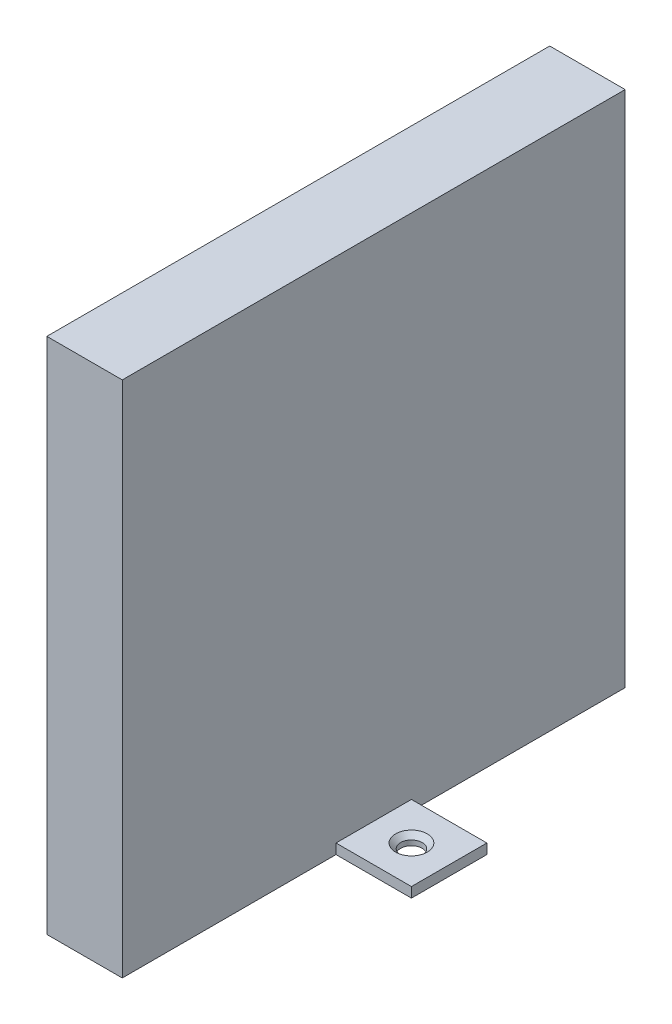
ISO-10303-21;
HEADER;
FILE_DESCRIPTION(('STEP AP214'),'2;1');
FILE_NAME('part.step','',(''),(''),'','','');
FILE_SCHEMA(('AUTOMOTIVE_DESIGN { 1 0 10303 214 1 1 1 1 }'));
ENDSEC;
DATA;
#1=APPLICATION_CONTEXT('core data for automotive mechanical design processes');
#2=APPLICATION_PROTOCOL_DEFINITION('international standard','automotive_design',2000,#1);
#3=PRODUCT_CONTEXT('',#1,'mechanical');
#4=PRODUCT('Part','Part','',(#3));
#5=PRODUCT_RELATED_PRODUCT_CATEGORY('part','',(#4));
#6=PRODUCT_DEFINITION_FORMATION('','',#4);
#7=PRODUCT_DEFINITION_CONTEXT('part definition',#1,'design');
#8=PRODUCT_DEFINITION('design','',#6,#7);
#9=PRODUCT_DEFINITION_SHAPE('','',#8);
#10=(LENGTH_UNIT() NAMED_UNIT(*) SI_UNIT(.MILLI.,.METRE.));
#11=(NAMED_UNIT(*) PLANE_ANGLE_UNIT() SI_UNIT($,.RADIAN.));
#12=(NAMED_UNIT(*) SI_UNIT($,.STERADIAN.) SOLID_ANGLE_UNIT());
#13=UNCERTAINTY_MEASURE_WITH_UNIT(LENGTH_MEASURE(1.E-05),#10,'distance_accuracy_value','');
#14=(GEOMETRIC_REPRESENTATION_CONTEXT(3) GLOBAL_UNCERTAINTY_ASSIGNED_CONTEXT((#13)) GLOBAL_UNIT_ASSIGNED_CONTEXT((#10,
#11,#12)) REPRESENTATION_CONTEXT('',''));
#15=CARTESIAN_POINT('',(0.,0.,0.));
#16=DIRECTION('',(0.,0.,1.));
#17=DIRECTION('',(1.,0.,0.));
#18=AXIS2_PLACEMENT_3D('',#15,#16,#17);
#19=CARTESIAN_POINT('',(15.,103.,0.));
#20=DIRECTION('',(-1.,0.,0.));
#21=DIRECTION('',(0.,0.,1.));
#22=AXIS2_PLACEMENT_3D('',#19,#20,#21);
#23=PLANE('',#22);
#24=DIRECTION('',(0.,-1.,0.));
#25=VECTOR('',#24,1.);
#26=CARTESIAN_POINT('',(15.,0.,-42.5));
#27=LINE('',#26,#25);
#28=CARTESIAN_POINT('',(15.,2.,-42.5));
#29=VERTEX_POINT('',#28);
#30=CARTESIAN_POINT('',(15.,0.,-42.5));
#31=VERTEX_POINT('',#30);
#32=EDGE_CURVE('E64',#29,#31,#27,.T.);
#33=ORIENTED_EDGE('',*,*,#32,.F.);
#34=DIRECTION('',(0.,0.,1.));
#35=VECTOR('',#34,1.);
#36=CARTESIAN_POINT('',(15.,2.,-42.5));
#37=LINE('',#36,#35);
#38=CARTESIAN_POINT('',(15.,2.,-57.5));
#39=VERTEX_POINT('',#38);
#40=EDGE_CURVE('E320',#39,#29,#37,.T.);
#41=ORIENTED_EDGE('',*,*,#40,.F.);
#42=DIRECTION('',(0.,1.,0.));
#43=VECTOR('',#42,1.);
#44=CARTESIAN_POINT('',(15.,2.,-57.5));
#45=LINE('',#44,#43);
#46=CARTESIAN_POINT('',(15.,0.,-57.5));
#47=VERTEX_POINT('',#46);
#48=EDGE_CURVE('E70',#47,#39,#45,.T.);
#49=ORIENTED_EDGE('',*,*,#48,.F.);
#50=DIRECTION('',(0.,0.,-1.));
#51=VECTOR('',#50,1.);
#52=CARTESIAN_POINT('',(15.,0.,0.));
#53=LINE('',#52,#51);
#54=CARTESIAN_POINT('',(15.,0.,-100.));
#55=VERTEX_POINT('',#54);
#56=EDGE_CURVE('E162',#47,#55,#53,.T.);
#57=ORIENTED_EDGE('',*,*,#56,.T.);
#58=DIRECTION('',(0.,-1.,0.));
#59=VECTOR('',#58,1.);
#60=CARTESIAN_POINT('',(15.,103.,-100.));
#61=LINE('',#60,#59);
#62=CARTESIAN_POINT('',(15.,103.,-100.));
#63=VERTEX_POINT('',#62);
#64=EDGE_CURVE('E241',#63,#55,#61,.T.);
#65=ORIENTED_EDGE('',*,*,#64,.F.);
#66=DIRECTION('',(0.,0.,-1.));
#67=VECTOR('',#66,1.);
#68=CARTESIAN_POINT('',(15.,103.,0.));
#69=LINE('',#68,#67);
#70=CARTESIAN_POINT('',(15.,103.,0.));
#71=VERTEX_POINT('',#70);
#72=EDGE_CURVE('E220',#71,#63,#69,.T.);
#73=ORIENTED_EDGE('',*,*,#72,.F.);
#74=DIRECTION('',(0.,-1.,0.));
#75=VECTOR('',#74,1.);
#76=CARTESIAN_POINT('',(15.,103.,0.));
#77=LINE('',#76,#75);
#78=CARTESIAN_POINT('',(15.,0.,0.));
#79=VERTEX_POINT('',#78);
#80=EDGE_CURVE('E245',#71,#79,#77,.T.);
#81=ORIENTED_EDGE('',*,*,#80,.T.);
#82=EDGE_CURVE('E233',#79,#31,#53,.T.);
#83=ORIENTED_EDGE('',*,*,#82,.T.);
#84=EDGE_LOOP('',(#33,#41,#49,#57,#65,#73,#81,#83));
#85=FACE_BOUND('',#84,.T.);
#86=ADVANCED_FACE('F47',(#85),#23,.F.);
#87=CARTESIAN_POINT('',(0.,103.,-100.));
#88=DIRECTION('',(1.,0.,0.));
#89=DIRECTION('',(0.,0.,-1.));
#90=AXIS2_PLACEMENT_3D('',#87,#88,#89);
#91=PLANE('',#90);
#92=DIRECTION('',(0.,-1.,0.));
#93=VECTOR('',#92,1.);
#94=CARTESIAN_POINT('',(0.,0.,-57.5));
#95=LINE('',#94,#93);
#96=CARTESIAN_POINT('',(0.,2.,-57.5));
#97=VERTEX_POINT('',#96);
#98=CARTESIAN_POINT('',(0.,0.,-57.5));
#99=VERTEX_POINT('',#98);
#100=EDGE_CURVE('E180',#97,#99,#95,.T.);
#101=ORIENTED_EDGE('',*,*,#100,.F.);
#102=DIRECTION('',(0.,0.,-1.));
#103=VECTOR('',#102,1.);
#104=CARTESIAN_POINT('',(0.,2.,-57.5));
#105=LINE('',#104,#103);
#106=CARTESIAN_POINT('',(0.,2.,-42.5));
#107=VERTEX_POINT('',#106);
#108=EDGE_CURVE('E169',#107,#97,#105,.T.);
#109=ORIENTED_EDGE('',*,*,#108,.F.);
#110=DIRECTION('',(0.,1.,0.));
#111=VECTOR('',#110,1.);
#112=CARTESIAN_POINT('',(0.,2.,-42.5));
#113=LINE('',#112,#111);
#114=CARTESIAN_POINT('',(0.,0.,-42.5));
#115=VERTEX_POINT('',#114);
#116=EDGE_CURVE('E164',#115,#107,#113,.T.);
#117=ORIENTED_EDGE('',*,*,#116,.F.);
#118=DIRECTION('',(0.,0.,1.));
#119=VECTOR('',#118,1.);
#120=CARTESIAN_POINT('',(0.,0.,-100.));
#121=LINE('',#120,#119);
#122=CARTESIAN_POINT('',(0.,0.,0.));
#123=VERTEX_POINT('',#122);
#124=EDGE_CURVE('E211',#115,#123,#121,.T.);
#125=ORIENTED_EDGE('',*,*,#124,.T.);
#126=DIRECTION('',(0.,-1.,0.));
#127=VECTOR('',#126,1.);
#128=CARTESIAN_POINT('',(0.,103.,0.));
#129=LINE('',#128,#127);
#130=CARTESIAN_POINT('',(0.,103.,0.));
#131=VERTEX_POINT('',#130);
#132=EDGE_CURVE('E249',#131,#123,#129,.T.);
#133=ORIENTED_EDGE('',*,*,#132,.F.);
#134=DIRECTION('',(0.,0.,1.));
#135=VECTOR('',#134,1.);
#136=CARTESIAN_POINT('',(0.,103.,-100.));
#137=LINE('',#136,#135);
#138=CARTESIAN_POINT('',(0.,103.,-100.));
#139=VERTEX_POINT('',#138);
#140=EDGE_CURVE('E212',#139,#131,#137,.T.);
#141=ORIENTED_EDGE('',*,*,#140,.F.);
#142=DIRECTION('',(0.,-1.,0.));
#143=VECTOR('',#142,1.);
#144=CARTESIAN_POINT('',(0.,103.,-100.));
#145=LINE('',#144,#143);
#146=CARTESIAN_POINT('',(0.,0.,-100.));
#147=VERTEX_POINT('',#146);
#148=EDGE_CURVE('E226',#139,#147,#145,.T.);
#149=ORIENTED_EDGE('',*,*,#148,.T.);
#150=EDGE_CURVE('E227',#147,#99,#121,.T.);
#151=ORIENTED_EDGE('',*,*,#150,.T.);
#152=EDGE_LOOP('',(#101,#109,#117,#125,#133,#141,#149,#151));
#153=FACE_BOUND('',#152,.T.);
#154=ADVANCED_FACE('F276',(#153),#91,.F.);
#155=CARTESIAN_POINT('',(0.,103.,0.));
#156=DIRECTION('',(0.,0.,-1.));
#157=DIRECTION('',(-1.,0.,0.));
#158=AXIS2_PLACEMENT_3D('',#155,#156,#157);
#159=PLANE('',#158);
#160=DIRECTION('',(1.,0.,0.));
#161=VECTOR('',#160,1.);
#162=CARTESIAN_POINT('',(0.,0.,0.));
#163=LINE('',#162,#161);
#164=EDGE_CURVE('E230',#123,#79,#163,.T.);
#165=ORIENTED_EDGE('',*,*,#164,.T.);
#166=ORIENTED_EDGE('',*,*,#80,.F.);
#167=DIRECTION('',(1.,0.,0.));
#168=VECTOR('',#167,1.);
#169=CARTESIAN_POINT('',(0.,103.,0.));
#170=LINE('',#169,#168);
#171=EDGE_CURVE('E216',#131,#71,#170,.T.);
#172=ORIENTED_EDGE('',*,*,#171,.F.);
#173=ORIENTED_EDGE('',*,*,#132,.T.);
#174=EDGE_LOOP('',(#165,#166,#172,#173));
#175=FACE_BOUND('',#174,.T.);
#176=ADVANCED_FACE('F283',(#175),#159,.F.);
#177=CARTESIAN_POINT('',(15.,103.,-100.));
#178=DIRECTION('',(0.,0.,1.));
#179=DIRECTION('',(1.,0.,0.));
#180=AXIS2_PLACEMENT_3D('',#177,#178,#179);
#181=PLANE('',#180);
#182=DIRECTION('',(-1.,0.,0.));
#183=VECTOR('',#182,1.);
#184=CARTESIAN_POINT('',(15.,0.,-100.));
#185=LINE('',#184,#183);
#186=EDGE_CURVE('E217',#55,#147,#185,.T.);
#187=ORIENTED_EDGE('',*,*,#186,.T.);
#188=ORIENTED_EDGE('',*,*,#148,.F.);
#189=DIRECTION('',(-1.,0.,0.));
#190=VECTOR('',#189,1.);
#191=CARTESIAN_POINT('',(15.,103.,-100.));
#192=LINE('',#191,#190);
#193=EDGE_CURVE('E223',#63,#139,#192,.T.);
#194=ORIENTED_EDGE('',*,*,#193,.F.);
#195=ORIENTED_EDGE('',*,*,#64,.T.);
#196=EDGE_LOOP('',(#187,#188,#194,#195));
#197=FACE_BOUND('',#196,.T.);
#198=ADVANCED_FACE('F288',(#197),#181,.F.);
#199=CARTESIAN_POINT('',(0.,103.,0.));
#200=DIRECTION('',(0.,1.,0.));
#201=DIRECTION('',(0.,0.,1.));
#202=AXIS2_PLACEMENT_3D('',#199,#200,#201);
#203=PLANE('',#202);
#204=ORIENTED_EDGE('',*,*,#140,.T.);
#205=ORIENTED_EDGE('',*,*,#171,.T.);
#206=ORIENTED_EDGE('',*,*,#72,.T.);
#207=ORIENTED_EDGE('',*,*,#193,.T.);
#208=EDGE_LOOP('',(#204,#205,#206,#207));
#209=FACE_BOUND('',#208,.T.);
#210=ADVANCED_FACE('F300',(#209),#203,.T.);
#211=CARTESIAN_POINT('',(0.,0.,0.));
#212=DIRECTION('',(0.,1.,0.));
#213=DIRECTION('',(0.,0.,1.));
#214=AXIS2_PLACEMENT_3D('',#211,#212,#213);
#215=PLANE('',#214);
#216=CARTESIAN_POINT('',(-7.5,0.,-50.));
#217=DIRECTION('',(0.,1.,0.));
#218=DIRECTION('',(0.,0.,1.));
#219=AXIS2_PLACEMENT_3D('',#216,#217,#218);
#220=CIRCLE('',#219,2.15);
#221=CARTESIAN_POINT('',(-7.5,0.,-47.85));
#222=VERTEX_POINT('',#221);
#223=EDGE_CURVE('E324',#222,#222,#220,.T.);
#224=ORIENTED_EDGE('',*,*,#223,.T.);
#225=EDGE_LOOP('',(#224));
#226=FACE_BOUND('',#225,.T.);
#227=CARTESIAN_POINT('',(22.5,0.,-50.));
#228=DIRECTION('',(0.,1.,0.));
#229=DIRECTION('',(0.,0.,1.));
#230=AXIS2_PLACEMENT_3D('',#227,#228,#229);
#231=CIRCLE('',#230,2.15);
#232=CARTESIAN_POINT('',(22.5,0.,-47.85));
#233=VERTEX_POINT('',#232);
#234=EDGE_CURVE('E331',#233,#233,#231,.T.);
#235=ORIENTED_EDGE('',*,*,#234,.T.);
#236=EDGE_LOOP('',(#235));
#237=FACE_BOUND('',#236,.T.);
#238=ORIENTED_EDGE('',*,*,#150,.F.);
#239=ORIENTED_EDGE('',*,*,#186,.F.);
#240=ORIENTED_EDGE('',*,*,#56,.F.);
#241=DIRECTION('',(-1.,0.,0.));
#242=VECTOR('',#241,1.);
#243=CARTESIAN_POINT('',(30.,0.,-57.5));
#244=LINE('',#243,#242);
#245=CARTESIAN_POINT('',(30.,0.,-57.5));
#246=VERTEX_POINT('',#245);
#247=EDGE_CURVE('E141',#246,#47,#244,.T.);
#248=ORIENTED_EDGE('',*,*,#247,.F.);
#249=DIRECTION('',(0.,0.,-1.));
#250=VECTOR('',#249,1.);
#251=CARTESIAN_POINT('',(30.,0.,-42.5));
#252=LINE('',#251,#250);
#253=CARTESIAN_POINT('',(30.,0.,-42.5));
#254=VERTEX_POINT('',#253);
#255=EDGE_CURVE('E148',#254,#246,#252,.T.);
#256=ORIENTED_EDGE('',*,*,#255,.F.);
#257=DIRECTION('',(-1.,0.,0.));
#258=VECTOR('',#257,1.);
#259=CARTESIAN_POINT('',(30.,0.,-42.5));
#260=LINE('',#259,#258);
#261=EDGE_CURVE('E309',#254,#31,#260,.T.);
#262=ORIENTED_EDGE('',*,*,#261,.T.);
#263=ORIENTED_EDGE('',*,*,#82,.F.);
#264=ORIENTED_EDGE('',*,*,#164,.F.);
#265=ORIENTED_EDGE('',*,*,#124,.F.);
#266=DIRECTION('',(1.,0.,0.));
#267=VECTOR('',#266,1.);
#268=CARTESIAN_POINT('',(-15.,0.,-42.5));
#269=LINE('',#268,#267);
#270=CARTESIAN_POINT('',(-15.,0.,-42.5));
#271=VERTEX_POINT('',#270);
#272=EDGE_CURVE('E207',#271,#115,#269,.T.);
#273=ORIENTED_EDGE('',*,*,#272,.F.);
#274=DIRECTION('',(0.,0.,1.));
#275=VECTOR('',#274,1.);
#276=CARTESIAN_POINT('',(-15.,0.,-42.5));
#277=LINE('',#276,#275);
#278=CARTESIAN_POINT('',(-15.,0.,-57.5));
#279=VERTEX_POINT('',#278);
#280=EDGE_CURVE('E175',#279,#271,#277,.T.);
#281=ORIENTED_EDGE('',*,*,#280,.F.);
#282=DIRECTION('',(1.,0.,0.));
#283=VECTOR('',#282,1.);
#284=CARTESIAN_POINT('',(-15.,0.,-57.5));
#285=LINE('',#284,#283);
#286=EDGE_CURVE('E188',#279,#99,#285,.T.);
#287=ORIENTED_EDGE('',*,*,#286,.T.);
#288=EDGE_LOOP('',(#238,#239,#240,#248,#256,#262,#263,#264,#265,#273,#281,#287));
#289=FACE_BOUND('',#288,.T.);
#290=ADVANCED_FACE('F160',(#226,#237,#289),#215,.F.);
#291=CARTESIAN_POINT('',(-15.,2.,-42.5));
#292=DIRECTION('',(0.,0.,-1.));
#293=DIRECTION('',(-1.,0.,0.));
#294=AXIS2_PLACEMENT_3D('',#291,#292,#293);
#295=PLANE('',#294);
#296=ORIENTED_EDGE('',*,*,#116,.T.);
#297=DIRECTION('',(1.,0.,0.));
#298=VECTOR('',#297,1.);
#299=CARTESIAN_POINT('',(-15.,2.,-42.5));
#300=LINE('',#299,#298);
#301=CARTESIAN_POINT('',(-15.,2.,-42.5));
#302=VERTEX_POINT('',#301);
#303=EDGE_CURVE('E203',#302,#107,#300,.T.);
#304=ORIENTED_EDGE('',*,*,#303,.F.);
#305=DIRECTION('',(0.,1.,0.));
#306=VECTOR('',#305,1.);
#307=CARTESIAN_POINT('',(-15.,2.,-42.5));
#308=LINE('',#307,#306);
#309=EDGE_CURVE('E179',#271,#302,#308,.T.);
#310=ORIENTED_EDGE('',*,*,#309,.F.);
#311=ORIENTED_EDGE('',*,*,#272,.T.);
#312=EDGE_LOOP('',(#296,#304,#310,#311));
#313=FACE_BOUND('',#312,.T.);
#314=ADVANCED_FACE('F366',(#313),#295,.F.);
#315=CARTESIAN_POINT('',(-15.,2.,-57.5));
#316=DIRECTION('',(0.,-1.,0.));
#317=DIRECTION('',(0.,0.,-1.));
#318=AXIS2_PLACEMENT_3D('',#315,#316,#317);
#319=PLANE('',#318);
#320=CARTESIAN_POINT('',(-7.5,2.,-50.));
#321=DIRECTION('',(0.,-1.,0.));
#322=DIRECTION('',(0.,0.,-1.));
#323=AXIS2_PLACEMENT_3D('',#320,#321,#322);
#324=CIRCLE('',#323,3.15);
#325=CARTESIAN_POINT('',(-7.5,2.,-53.15));
#326=VERTEX_POINT('',#325);
#327=EDGE_CURVE('E11',#326,#326,#324,.T.);
#328=ORIENTED_EDGE('',*,*,#327,.T.);
#329=EDGE_LOOP('',(#328));
#330=FACE_BOUND('',#329,.T.);
#331=ORIENTED_EDGE('',*,*,#108,.T.);
#332=DIRECTION('',(1.,0.,0.));
#333=VECTOR('',#332,1.);
#334=CARTESIAN_POINT('',(-15.,2.,-57.5));
#335=LINE('',#334,#333);
#336=CARTESIAN_POINT('',(-15.,2.,-57.5));
#337=VERTEX_POINT('',#336);
#338=EDGE_CURVE('E199',#337,#97,#335,.T.);
#339=ORIENTED_EDGE('',*,*,#338,.F.);
#340=DIRECTION('',(0.,0.,-1.));
#341=VECTOR('',#340,1.);
#342=CARTESIAN_POINT('',(-15.,2.,-57.5));
#343=LINE('',#342,#341);
#344=EDGE_CURVE('E183',#302,#337,#343,.T.);
#345=ORIENTED_EDGE('',*,*,#344,.F.);
#346=ORIENTED_EDGE('',*,*,#303,.T.);
#347=EDGE_LOOP('',(#331,#339,#345,#346));
#348=FACE_BOUND('',#347,.T.);
#349=ADVANCED_FACE('F362',(#330,#348),#319,.F.);
#350=CARTESIAN_POINT('',(-15.,0.,-57.5));
#351=DIRECTION('',(0.,0.,1.));
#352=DIRECTION('',(0.,-1.,0.));
#353=AXIS2_PLACEMENT_3D('',#350,#351,#352);
#354=PLANE('',#353);
#355=ORIENTED_EDGE('',*,*,#100,.T.);
#356=ORIENTED_EDGE('',*,*,#286,.F.);
#357=DIRECTION('',(0.,-1.,0.));
#358=VECTOR('',#357,1.);
#359=CARTESIAN_POINT('',(-15.,0.,-57.5));
#360=LINE('',#359,#358);
#361=EDGE_CURVE('E186',#337,#279,#360,.T.);
#362=ORIENTED_EDGE('',*,*,#361,.F.);
#363=ORIENTED_EDGE('',*,*,#338,.T.);
#364=EDGE_LOOP('',(#355,#356,#362,#363));
#365=FACE_BOUND('',#364,.T.);
#366=ADVANCED_FACE('F358',(#365),#354,.F.);
#367=CARTESIAN_POINT('',(-15.,0.,0.));
#368=DIRECTION('',(1.,0.,0.));
#369=DIRECTION('',(0.,0.,-1.));
#370=AXIS2_PLACEMENT_3D('',#367,#368,#369);
#371=PLANE('',#370);
#372=ORIENTED_EDGE('',*,*,#280,.T.);
#373=ORIENTED_EDGE('',*,*,#309,.T.);
#374=ORIENTED_EDGE('',*,*,#344,.T.);
#375=ORIENTED_EDGE('',*,*,#361,.T.);
#376=EDGE_LOOP('',(#372,#373,#374,#375));
#377=FACE_BOUND('',#376,.T.);
#378=ADVANCED_FACE('F356',(#377),#371,.F.);
#379=CARTESIAN_POINT('',(30.,2.,-57.5));
#380=DIRECTION('',(0.,0.,1.));
#381=DIRECTION('',(1.,0.,0.));
#382=AXIS2_PLACEMENT_3D('',#379,#380,#381);
#383=PLANE('',#382);
#384=ORIENTED_EDGE('',*,*,#48,.T.);
#385=DIRECTION('',(-1.,0.,0.));
#386=VECTOR('',#385,1.);
#387=CARTESIAN_POINT('',(30.,2.,-57.5));
#388=LINE('',#387,#386);
#389=CARTESIAN_POINT('',(30.,2.,-57.5));
#390=VERTEX_POINT('',#389);
#391=EDGE_CURVE('E143',#390,#39,#388,.T.);
#392=ORIENTED_EDGE('',*,*,#391,.F.);
#393=DIRECTION('',(0.,1.,0.));
#394=VECTOR('',#393,1.);
#395=CARTESIAN_POINT('',(30.,2.,-57.5));
#396=LINE('',#395,#394);
#397=EDGE_CURVE('E137',#246,#390,#396,.T.);
#398=ORIENTED_EDGE('',*,*,#397,.F.);
#399=ORIENTED_EDGE('',*,*,#247,.T.);
#400=EDGE_LOOP('',(#384,#392,#398,#399));
#401=FACE_BOUND('',#400,.T.);
#402=ADVANCED_FACE('F139',(#401),#383,.F.);
#403=CARTESIAN_POINT('',(30.,2.,-42.5));
#404=DIRECTION('',(0.,-1.,0.));
#405=DIRECTION('',(0.,0.,-1.));
#406=AXIS2_PLACEMENT_3D('',#403,#404,#405);
#407=PLANE('',#406);
#408=CARTESIAN_POINT('',(22.5,2.,-50.));
#409=DIRECTION('',(0.,-1.,0.));
#410=DIRECTION('',(0.,0.,-1.));
#411=AXIS2_PLACEMENT_3D('',#408,#409,#410);
#412=CIRCLE('',#411,3.15000000000003);
#413=CARTESIAN_POINT('',(22.5,2.,-53.15));
#414=VERTEX_POINT('',#413);
#415=EDGE_CURVE('E257',#414,#414,#412,.T.);
#416=ORIENTED_EDGE('',*,*,#415,.T.);
#417=EDGE_LOOP('',(#416));
#418=FACE_BOUND('',#417,.T.);
#419=ORIENTED_EDGE('',*,*,#40,.T.);
#420=DIRECTION('',(-1.,0.,0.));
#421=VECTOR('',#420,1.);
#422=CARTESIAN_POINT('',(30.,2.,-42.5));
#423=LINE('',#422,#421);
#424=CARTESIAN_POINT('',(30.,2.,-42.5));
#425=VERTEX_POINT('',#424);
#426=EDGE_CURVE('E171',#425,#29,#423,.T.);
#427=ORIENTED_EDGE('',*,*,#426,.F.);
#428=DIRECTION('',(0.,0.,1.));
#429=VECTOR('',#428,1.);
#430=CARTESIAN_POINT('',(30.,2.,-42.5));
#431=LINE('',#430,#429);
#432=EDGE_CURVE('E147',#390,#425,#431,.T.);
#433=ORIENTED_EDGE('',*,*,#432,.F.);
#434=ORIENTED_EDGE('',*,*,#391,.T.);
#435=EDGE_LOOP('',(#419,#427,#433,#434));
#436=FACE_BOUND('',#435,.T.);
#437=ADVANCED_FACE('F352',(#418,#436),#407,.F.);
#438=CARTESIAN_POINT('',(30.,0.,-42.5));
#439=DIRECTION('',(0.,0.,-1.));
#440=DIRECTION('',(-1.,0.,0.));
#441=AXIS2_PLACEMENT_3D('',#438,#439,#440);
#442=PLANE('',#441);
#443=ORIENTED_EDGE('',*,*,#32,.T.);
#444=ORIENTED_EDGE('',*,*,#261,.F.);
#445=DIRECTION('',(0.,-1.,0.));
#446=VECTOR('',#445,1.);
#447=CARTESIAN_POINT('',(30.,0.,-42.5));
#448=LINE('',#447,#446);
#449=EDGE_CURVE('E153',#425,#254,#448,.T.);
#450=ORIENTED_EDGE('',*,*,#449,.F.);
#451=ORIENTED_EDGE('',*,*,#426,.T.);
#452=EDGE_LOOP('',(#443,#444,#450,#451));
#453=FACE_BOUND('',#452,.T.);
#454=ADVANCED_FACE('F347',(#453),#442,.F.);
#455=CARTESIAN_POINT('',(30.,0.,0.));
#456=DIRECTION('',(-1.,0.,0.));
#457=DIRECTION('',(0.,0.,1.));
#458=AXIS2_PLACEMENT_3D('',#455,#456,#457);
#459=PLANE('',#458);
#460=ORIENTED_EDGE('',*,*,#255,.T.);
#461=ORIENTED_EDGE('',*,*,#397,.T.);
#462=ORIENTED_EDGE('',*,*,#432,.T.);
#463=ORIENTED_EDGE('',*,*,#449,.T.);
#464=EDGE_LOOP('',(#460,#461,#462,#463));
#465=FACE_BOUND('',#464,.T.);
#466=ADVANCED_FACE('F151',(#465),#459,.F.);
#467=CARTESIAN_POINT('',(22.5,-13.,-50.));
#468=DIRECTION('',(0.,1.,0.));
#469=DIRECTION('',(0.,0.,1.));
#470=AXIS2_PLACEMENT_3D('',#467,#468,#469);
#471=CYLINDRICAL_SURFACE('',#470,2.15);
#472=CARTESIAN_POINT('',(22.5,0.999999999999963,-50.));
#473=DIRECTION('',(0.,-1.,0.));
#474=DIRECTION('',(0.,0.,-1.));
#475=AXIS2_PLACEMENT_3D('',#472,#473,#474);
#476=CIRCLE('',#475,2.15);
#477=CARTESIAN_POINT('',(22.5,0.999999999999963,-52.15));
#478=VERTEX_POINT('',#477);
#479=EDGE_CURVE('E253',#478,#478,#476,.F.);
#480=ORIENTED_EDGE('',*,*,#479,.T.);
#481=EDGE_LOOP('',(#480));
#482=FACE_BOUND('',#481,.T.);
#483=ORIENTED_EDGE('',*,*,#234,.F.);
#484=EDGE_LOOP('',(#483));
#485=FACE_BOUND('',#484,.T.);
#486=ADVANCED_FACE('F337',(#482,#485),#471,.F.);
#487=CARTESIAN_POINT('',(-7.5,-13.,-50.));
#488=DIRECTION('',(0.,1.,0.));
#489=DIRECTION('',(0.,0.,1.));
#490=AXIS2_PLACEMENT_3D('',#487,#488,#489);
#491=CYLINDRICAL_SURFACE('',#490,2.15);
#492=CARTESIAN_POINT('',(-7.5,1.00000000000001,-50.));
#493=DIRECTION('',(0.,-1.,0.));
#494=DIRECTION('',(0.,0.,-1.));
#495=AXIS2_PLACEMENT_3D('',#492,#493,#494);
#496=CIRCLE('',#495,2.15);
#497=CARTESIAN_POINT('',(-7.5,1.00000000000001,-52.15));
#498=VERTEX_POINT('',#497);
#499=EDGE_CURVE('E57',#498,#498,#496,.F.);
#500=ORIENTED_EDGE('',*,*,#499,.T.);
#501=EDGE_LOOP('',(#500));
#502=FACE_BOUND('',#501,.T.);
#503=ORIENTED_EDGE('',*,*,#223,.F.);
#504=EDGE_LOOP('',(#503));
#505=FACE_BOUND('',#504,.T.);
#506=ADVANCED_FACE('F264',(#502,#505),#491,.F.);
#507=CARTESIAN_POINT('',(22.5,0.999999999999963,-50.));
#508=DIRECTION('',(0.,1.,0.));
#509=DIRECTION('',(0.,0.,1.));
#510=AXIS2_PLACEMENT_3D('',#507,#508,#509);
#511=CONICAL_SURFACE('',#510,2.15,0.785398163397445);
#512=ORIENTED_EDGE('',*,*,#415,.F.);
#513=EDGE_LOOP('',(#512));
#514=FACE_BOUND('',#513,.T.);
#515=ORIENTED_EDGE('',*,*,#479,.F.);
#516=EDGE_LOOP('',(#515));
#517=FACE_BOUND('',#516,.T.);
#518=ADVANCED_FACE('F268',(#514,#517),#511,.F.);
#519=CARTESIAN_POINT('',(-7.5,1.00000000000001,-50.));
#520=DIRECTION('',(0.,1.,0.));
#521=DIRECTION('',(0.,0.,1.));
#522=AXIS2_PLACEMENT_3D('',#519,#520,#521);
#523=CONICAL_SURFACE('',#522,2.15,0.785398163397452);
#524=ORIENTED_EDGE('',*,*,#327,.F.);
#525=EDGE_LOOP('',(#524));
#526=FACE_BOUND('',#525,.T.);
#527=ORIENTED_EDGE('',*,*,#499,.F.);
#528=EDGE_LOOP('',(#527));
#529=FACE_BOUND('',#528,.T.);
#530=ADVANCED_FACE('F50',(#526,#529),#523,.F.);
#531=CLOSED_SHELL('',(#86,#154,#176,#198,#210,#290,#314,#349,#366,#378,#402,#437,#454,#466,#486,
#506,#518,#530));
#532=MANIFOLD_SOLID_BREP('B2',#531);
#533=ADVANCED_BREP_SHAPE_REPRESENTATION('',(#18,#532),#14);
#534=SHAPE_DEFINITION_REPRESENTATION(#9,#533);
ENDSEC;
END-ISO-10303-21;
